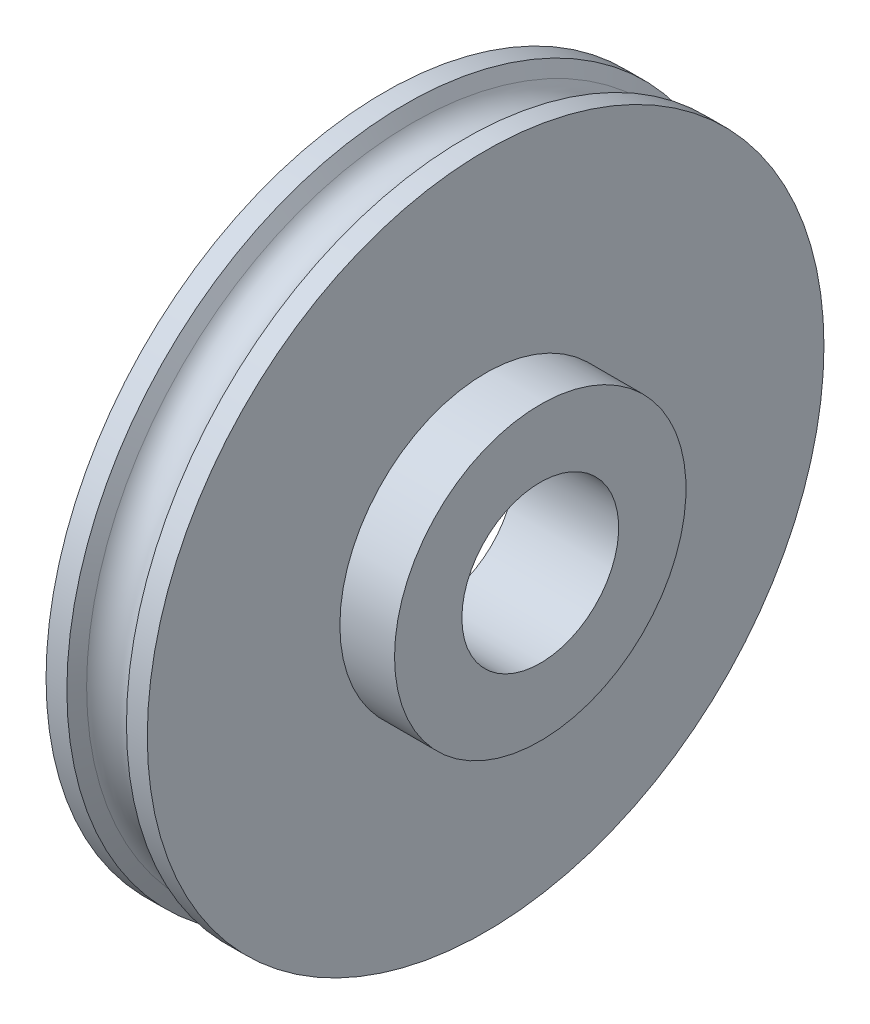
ISO-10303-21;
HEADER;
FILE_DESCRIPTION(('STEP AP214'),'2;1');
FILE_NAME('part.step','',(''),(''),'','','');
FILE_SCHEMA(('AUTOMOTIVE_DESIGN { 1 0 10303 214 1 1 1 1 }'));
ENDSEC;
DATA;
#1=APPLICATION_CONTEXT('core data for automotive mechanical design processes');
#2=APPLICATION_PROTOCOL_DEFINITION('international standard','automotive_design',2000,#1);
#3=PRODUCT_CONTEXT('',#1,'mechanical');
#4=PRODUCT('Part','Part','',(#3));
#5=PRODUCT_RELATED_PRODUCT_CATEGORY('part','',(#4));
#6=PRODUCT_DEFINITION_FORMATION('','',#4);
#7=PRODUCT_DEFINITION_CONTEXT('part definition',#1,'design');
#8=PRODUCT_DEFINITION('design','',#6,#7);
#9=PRODUCT_DEFINITION_SHAPE('','',#8);
#10=(LENGTH_UNIT() NAMED_UNIT(*) SI_UNIT(.MILLI.,.METRE.));
#11=(NAMED_UNIT(*) PLANE_ANGLE_UNIT() SI_UNIT($,.RADIAN.));
#12=(NAMED_UNIT(*) SI_UNIT($,.STERADIAN.) SOLID_ANGLE_UNIT());
#13=UNCERTAINTY_MEASURE_WITH_UNIT(LENGTH_MEASURE(1.E-05),#10,'distance_accuracy_value','');
#14=(GEOMETRIC_REPRESENTATION_CONTEXT(3) GLOBAL_UNCERTAINTY_ASSIGNED_CONTEXT((#13)) GLOBAL_UNIT_ASSIGNED_CONTEXT((#10,
#11,#12)) REPRESENTATION_CONTEXT('',''));
#15=CARTESIAN_POINT('',(0.,0.,0.));
#16=DIRECTION('',(0.,0.,1.));
#17=DIRECTION('',(1.,0.,0.));
#18=AXIS2_PLACEMENT_3D('',#15,#16,#17);
#19=CARTESIAN_POINT('',(0.9725,0.,0.));
#20=DIRECTION('',(-1.,0.,0.));
#21=DIRECTION('',(0.,0.,1.));
#22=AXIS2_PLACEMENT_3D('',#19,#20,#21);
#23=TOROIDAL_SURFACE('',#22,6.5,0.5);
#24=CARTESIAN_POINT('',(1.40918122270742,0.,0.));
#25=DIRECTION('',(-1.,0.,0.));
#26=DIRECTION('',(0.,0.,1.));
#27=AXIS2_PLACEMENT_3D('',#24,#25,#26);
#28=CIRCLE('',#27,6.25646456164502);
#29=CARTESIAN_POINT('',(1.40918122270742,0.,6.25646456164502));
#30=VERTEX_POINT('',#29);
#31=EDGE_CURVE('E88',#30,#30,#28,.T.);
#32=ORIENTED_EDGE('',*,*,#31,.T.);
#33=EDGE_LOOP('',(#32));
#34=FACE_BOUND('',#33,.T.);
#35=CARTESIAN_POINT('',(0.535818777292576,0.,0.));
#36=DIRECTION('',(-1.,0.,0.));
#37=DIRECTION('',(0.,0.,1.));
#38=AXIS2_PLACEMENT_3D('',#35,#36,#37);
#39=CIRCLE('',#38,6.25646456164502);
#40=CARTESIAN_POINT('',(0.535818777292576,0.,6.25646456164502));
#41=VERTEX_POINT('',#40);
#42=EDGE_CURVE('E10',#41,#41,#39,.T.);
#43=ORIENTED_EDGE('',*,*,#42,.F.);
#44=EDGE_LOOP('',(#43));
#45=FACE_BOUND('',#44,.T.);
#46=ADVANCED_FACE('F37',(#34,#45),#23,.F.);
#47=CARTESIAN_POINT('',(0.4,0.,0.));
#48=DIRECTION('',(-1.,0.,0.));
#49=DIRECTION('',(0.,0.,1.));
#50=AXIS2_PLACEMENT_3D('',#47,#48,#49);
#51=CONICAL_SURFACE('',#50,6.5,1.06206356878481);
#52=ORIENTED_EDGE('',*,*,#42,.T.);
#53=EDGE_LOOP('',(#52));
#54=FACE_BOUND('',#53,.T.);
#55=CARTESIAN_POINT('',(0.4,0.,0.));
#56=DIRECTION('',(-1.,0.,0.));
#57=DIRECTION('',(0.,0.,1.));
#58=AXIS2_PLACEMENT_3D('',#55,#56,#57);
#59=CIRCLE('',#58,6.5);
#60=CARTESIAN_POINT('',(0.4,0.,6.5));
#61=VERTEX_POINT('',#60);
#62=EDGE_CURVE('E44',#61,#61,#59,.T.);
#63=ORIENTED_EDGE('',*,*,#62,.F.);
#64=EDGE_LOOP('',(#63));
#65=FACE_BOUND('',#64,.T.);
#66=ADVANCED_FACE('F108',(#54,#65),#51,.T.);
#67=CARTESIAN_POINT('',(0.,0.,0.));
#68=DIRECTION('',(-1.,0.,0.));
#69=DIRECTION('',(0.,0.,1.));
#70=AXIS2_PLACEMENT_3D('',#67,#68,#69);
#71=CYLINDRICAL_SURFACE('',#70,6.5);
#72=ORIENTED_EDGE('',*,*,#62,.T.);
#73=EDGE_LOOP('',(#72));
#74=FACE_BOUND('',#73,.T.);
#75=CARTESIAN_POINT('',(0.,0.,0.));
#76=DIRECTION('',(-1.,0.,0.));
#77=DIRECTION('',(0.,0.,1.));
#78=AXIS2_PLACEMENT_3D('',#75,#76,#77);
#79=CIRCLE('',#78,6.5);
#80=CARTESIAN_POINT('',(0.,0.,6.5));
#81=VERTEX_POINT('',#80);
#82=EDGE_CURVE('E49',#81,#81,#79,.T.);
#83=ORIENTED_EDGE('',*,*,#82,.F.);
#84=EDGE_LOOP('',(#83));
#85=FACE_BOUND('',#84,.T.);
#86=ADVANCED_FACE('F106',(#74,#85),#71,.T.);
#87=CARTESIAN_POINT('',(0.,0.,0.));
#88=DIRECTION('',(-1.,0.,0.));
#89=DIRECTION('',(0.,0.,1.));
#90=AXIS2_PLACEMENT_3D('',#87,#88,#89);
#91=PLANE('',#90);
#92=ORIENTED_EDGE('',*,*,#82,.T.);
#93=EDGE_LOOP('',(#92));
#94=FACE_BOUND('',#93,.T.);
#95=CARTESIAN_POINT('',(0.,0.,0.));
#96=DIRECTION('',(-1.,0.,0.));
#97=DIRECTION('',(0.,0.,1.));
#98=AXIS2_PLACEMENT_3D('',#95,#96,#97);
#99=CIRCLE('',#98,4.04);
#100=CARTESIAN_POINT('',(0.,0.,4.04));
#101=VERTEX_POINT('',#100);
#102=EDGE_CURVE('E54',#101,#101,#99,.T.);
#103=ORIENTED_EDGE('',*,*,#102,.F.);
#104=EDGE_LOOP('',(#103));
#105=FACE_BOUND('',#104,.T.);
#106=ADVANCED_FACE('F115',(#94,#105),#91,.T.);
#107=CARTESIAN_POINT('',(0.,0.,0.));
#108=DIRECTION('',(-1.,0.,0.));
#109=DIRECTION('',(0.,0.,1.));
#110=AXIS2_PLACEMENT_3D('',#107,#108,#109);
#111=CYLINDRICAL_SURFACE('',#110,4.04);
#112=ORIENTED_EDGE('',*,*,#102,.T.);
#113=EDGE_LOOP('',(#112));
#114=FACE_BOUND('',#113,.T.);
#115=CARTESIAN_POINT('',(1.,0.,0.));
#116=DIRECTION('',(-1.,0.,0.));
#117=DIRECTION('',(0.,0.,1.));
#118=AXIS2_PLACEMENT_3D('',#115,#116,#117);
#119=CIRCLE('',#118,4.04);
#120=CARTESIAN_POINT('',(1.,0.,4.04));
#121=VERTEX_POINT('',#120);
#122=EDGE_CURVE('E60',#121,#121,#119,.T.);
#123=ORIENTED_EDGE('',*,*,#122,.F.);
#124=EDGE_LOOP('',(#123));
#125=FACE_BOUND('',#124,.T.);
#126=ADVANCED_FACE('F120',(#114,#125),#111,.F.);
#127=CARTESIAN_POINT('',(1.,0.,0.));
#128=DIRECTION('',(-1.,0.,0.));
#129=DIRECTION('',(0.,0.,1.));
#130=AXIS2_PLACEMENT_3D('',#127,#128,#129);
#131=PLANE('',#130);
#132=ORIENTED_EDGE('',*,*,#122,.T.);
#133=EDGE_LOOP('',(#132));
#134=FACE_BOUND('',#133,.T.);
#135=CARTESIAN_POINT('',(1.,0.,0.));
#136=DIRECTION('',(-1.,0.,0.));
#137=DIRECTION('',(0.,0.,1.));
#138=AXIS2_PLACEMENT_3D('',#135,#136,#137);
#139=CIRCLE('',#138,1.506);
#140=CARTESIAN_POINT('',(1.,0.,1.506));
#141=VERTEX_POINT('',#140);
#142=EDGE_CURVE('E64',#141,#141,#139,.T.);
#143=ORIENTED_EDGE('',*,*,#142,.F.);
#144=EDGE_LOOP('',(#143));
#145=FACE_BOUND('',#144,.T.);
#146=ADVANCED_FACE('F124',(#134,#145),#131,.T.);
#147=CARTESIAN_POINT('',(0.,0.,0.));
#148=DIRECTION('',(-1.,0.,0.));
#149=DIRECTION('',(0.,0.,1.));
#150=AXIS2_PLACEMENT_3D('',#147,#148,#149);
#151=CYLINDRICAL_SURFACE('',#150,1.506);
#152=ORIENTED_EDGE('',*,*,#142,.T.);
#153=EDGE_LOOP('',(#152));
#154=FACE_BOUND('',#153,.T.);
#155=CARTESIAN_POINT('',(2.995,0.,0.));
#156=DIRECTION('',(-1.,0.,0.));
#157=DIRECTION('',(0.,0.,1.));
#158=AXIS2_PLACEMENT_3D('',#155,#156,#157);
#159=CIRCLE('',#158,1.506);
#160=CARTESIAN_POINT('',(2.995,0.,1.506));
#161=VERTEX_POINT('',#160);
#162=EDGE_CURVE('E68',#161,#161,#159,.T.);
#163=ORIENTED_EDGE('',*,*,#162,.F.);
#164=EDGE_LOOP('',(#163));
#165=FACE_BOUND('',#164,.T.);
#166=ADVANCED_FACE('F128',(#154,#165),#151,.F.);
#167=CARTESIAN_POINT('',(2.995,0.,0.));
#168=DIRECTION('',(1.,0.,0.));
#169=DIRECTION('',(0.,0.,-1.));
#170=AXIS2_PLACEMENT_3D('',#167,#168,#169);
#171=PLANE('',#170);
#172=ORIENTED_EDGE('',*,*,#162,.T.);
#173=EDGE_LOOP('',(#172));
#174=FACE_BOUND('',#173,.T.);
#175=CARTESIAN_POINT('',(2.995,0.,0.));
#176=DIRECTION('',(-1.,0.,0.));
#177=DIRECTION('',(0.,0.,1.));
#178=AXIS2_PLACEMENT_3D('',#175,#176,#177);
#179=CIRCLE('',#178,2.8);
#180=CARTESIAN_POINT('',(2.995,0.,2.8));
#181=VERTEX_POINT('',#180);
#182=EDGE_CURVE('E72',#181,#181,#179,.T.);
#183=ORIENTED_EDGE('',*,*,#182,.F.);
#184=EDGE_LOOP('',(#183));
#185=FACE_BOUND('',#184,.T.);
#186=ADVANCED_FACE('F132',(#174,#185),#171,.T.);
#187=CARTESIAN_POINT('',(0.,0.,0.));
#188=DIRECTION('',(-1.,0.,0.));
#189=DIRECTION('',(0.,0.,1.));
#190=AXIS2_PLACEMENT_3D('',#187,#188,#189);
#191=CYLINDRICAL_SURFACE('',#190,2.8);
#192=ORIENTED_EDGE('',*,*,#182,.T.);
#193=EDGE_LOOP('',(#192));
#194=FACE_BOUND('',#193,.T.);
#195=CARTESIAN_POINT('',(1.945,0.,0.));
#196=DIRECTION('',(-1.,0.,0.));
#197=DIRECTION('',(0.,0.,1.));
#198=AXIS2_PLACEMENT_3D('',#195,#196,#197);
#199=CIRCLE('',#198,2.8);
#200=CARTESIAN_POINT('',(1.945,0.,2.8));
#201=VERTEX_POINT('',#200);
#202=EDGE_CURVE('E76',#201,#201,#199,.T.);
#203=ORIENTED_EDGE('',*,*,#202,.F.);
#204=EDGE_LOOP('',(#203));
#205=FACE_BOUND('',#204,.T.);
#206=ADVANCED_FACE('F136',(#194,#205),#191,.T.);
#207=CARTESIAN_POINT('',(1.945,0.,0.));
#208=DIRECTION('',(1.,0.,0.));
#209=DIRECTION('',(0.,0.,-1.));
#210=AXIS2_PLACEMENT_3D('',#207,#208,#209);
#211=PLANE('',#210);
#212=ORIENTED_EDGE('',*,*,#202,.T.);
#213=EDGE_LOOP('',(#212));
#214=FACE_BOUND('',#213,.T.);
#215=CARTESIAN_POINT('',(1.945,0.,0.));
#216=DIRECTION('',(-1.,0.,0.));
#217=DIRECTION('',(0.,0.,1.));
#218=AXIS2_PLACEMENT_3D('',#215,#216,#217);
#219=CIRCLE('',#218,6.5);
#220=CARTESIAN_POINT('',(1.945,0.,6.5));
#221=VERTEX_POINT('',#220);
#222=EDGE_CURVE('E80',#221,#221,#219,.T.);
#223=ORIENTED_EDGE('',*,*,#222,.F.);
#224=EDGE_LOOP('',(#223));
#225=FACE_BOUND('',#224,.T.);
#226=ADVANCED_FACE('F103',(#214,#225),#211,.T.);
#227=ORIENTED_EDGE('',*,*,#222,.T.);
#228=EDGE_LOOP('',(#227));
#229=FACE_BOUND('',#228,.T.);
#230=CARTESIAN_POINT('',(1.545,0.,0.));
#231=DIRECTION('',(-1.,0.,0.));
#232=DIRECTION('',(0.,0.,1.));
#233=AXIS2_PLACEMENT_3D('',#230,#231,#232);
#234=CIRCLE('',#233,6.5);
#235=CARTESIAN_POINT('',(1.545,0.,6.5));
#236=VERTEX_POINT('',#235);
#237=EDGE_CURVE('E84',#236,#236,#234,.T.);
#238=ORIENTED_EDGE('',*,*,#237,.F.);
#239=EDGE_LOOP('',(#238));
#240=FACE_BOUND('',#239,.T.);
#241=ADVANCED_FACE('F97',(#229,#240),#71,.T.);
#242=CARTESIAN_POINT('',(1.40918122270742,0.,0.));
#243=DIRECTION('',(1.,0.,0.));
#244=DIRECTION('',(0.,0.,-1.));
#245=AXIS2_PLACEMENT_3D('',#242,#243,#244);
#246=CONICAL_SURFACE('',#245,6.25646456164502,1.06206356878481);
#247=ORIENTED_EDGE('',*,*,#237,.T.);
#248=EDGE_LOOP('',(#247));
#249=FACE_BOUND('',#248,.T.);
#250=ORIENTED_EDGE('',*,*,#31,.F.);
#251=EDGE_LOOP('',(#250));
#252=FACE_BOUND('',#251,.T.);
#253=ADVANCED_FACE('F95',(#249,#252),#246,.T.);
#254=CLOSED_SHELL('',(#46,#66,#86,#106,#126,#146,#166,#186,#206,#226,#241,#253));
#255=MANIFOLD_SOLID_BREP('B2',#254);
#256=ADVANCED_BREP_SHAPE_REPRESENTATION('',(#18,#255),#14);
#257=SHAPE_DEFINITION_REPRESENTATION(#9,#256);
ENDSEC;
END-ISO-10303-21;
